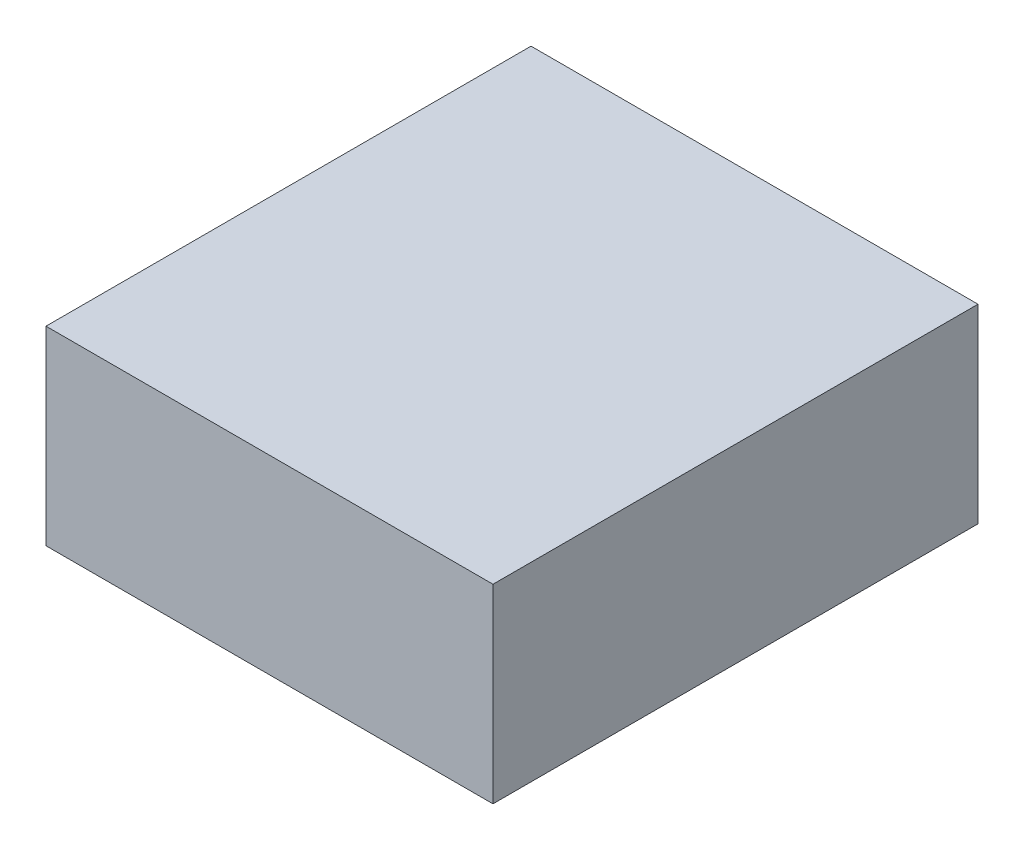
ISO-10303-21;
HEADER;
FILE_DESCRIPTION(('STEP AP214'),'2;1');
FILE_NAME('part.step','',(''),(''),'','','');
FILE_SCHEMA(('AUTOMOTIVE_DESIGN { 1 0 10303 214 1 1 1 1 }'));
ENDSEC;
DATA;
#1=APPLICATION_CONTEXT('core data for automotive mechanical design processes');
#2=APPLICATION_PROTOCOL_DEFINITION('international standard','automotive_design',2000,#1);
#3=PRODUCT_CONTEXT('',#1,'mechanical');
#4=PRODUCT('Part','Part','',(#3));
#5=PRODUCT_RELATED_PRODUCT_CATEGORY('part','',(#4));
#6=PRODUCT_DEFINITION_FORMATION('','',#4);
#7=PRODUCT_DEFINITION_CONTEXT('part definition',#1,'design');
#8=PRODUCT_DEFINITION('design','',#6,#7);
#9=PRODUCT_DEFINITION_SHAPE('','',#8);
#10=(LENGTH_UNIT() NAMED_UNIT(*) SI_UNIT(.MILLI.,.METRE.));
#11=(NAMED_UNIT(*) PLANE_ANGLE_UNIT() SI_UNIT($,.RADIAN.));
#12=(NAMED_UNIT(*) SI_UNIT($,.STERADIAN.) SOLID_ANGLE_UNIT());
#13=UNCERTAINTY_MEASURE_WITH_UNIT(LENGTH_MEASURE(1.E-05),#10,'distance_accuracy_value','');
#14=(GEOMETRIC_REPRESENTATION_CONTEXT(3) GLOBAL_UNCERTAINTY_ASSIGNED_CONTEXT((#13)) GLOBAL_UNIT_ASSIGNED_CONTEXT((#10,
#11,#12)) REPRESENTATION_CONTEXT('',''));
#15=CARTESIAN_POINT('',(0.,0.,0.));
#16=DIRECTION('',(0.,0.,1.));
#17=DIRECTION('',(1.,0.,0.));
#18=AXIS2_PLACEMENT_3D('',#15,#16,#17);
#19=CARTESIAN_POINT('',(23.5,20.,25.5));
#20=DIRECTION('',(-1.,0.,0.));
#21=DIRECTION('',(0.,0.,1.));
#22=AXIS2_PLACEMENT_3D('',#19,#20,#21);
#23=PLANE('',#22);
#24=DIRECTION('',(0.,0.,-1.));
#25=VECTOR('',#24,1.);
#26=CARTESIAN_POINT('',(23.5,0.,25.5));
#27=LINE('',#26,#25);
#28=CARTESIAN_POINT('',(23.5,0.,25.5));
#29=VERTEX_POINT('',#28);
#30=CARTESIAN_POINT('',(23.5,0.,-25.5));
#31=VERTEX_POINT('',#30);
#32=EDGE_CURVE('E97',#29,#31,#27,.T.);
#33=ORIENTED_EDGE('',*,*,#32,.T.);
#34=DIRECTION('',(0.,-1.,0.));
#35=VECTOR('',#34,1.);
#36=CARTESIAN_POINT('',(23.5,20.,-25.5));
#37=LINE('',#36,#35);
#38=CARTESIAN_POINT('',(23.5,20.,-25.5));
#39=VERTEX_POINT('',#38);
#40=EDGE_CURVE('E11',#39,#31,#37,.T.);
#41=ORIENTED_EDGE('',*,*,#40,.F.);
#42=DIRECTION('',(0.,0.,-1.));
#43=VECTOR('',#42,1.);
#44=CARTESIAN_POINT('',(23.5,20.,25.5));
#45=LINE('',#44,#43);
#46=CARTESIAN_POINT('',(23.5,20.,25.5));
#47=VERTEX_POINT('',#46);
#48=EDGE_CURVE('E85',#47,#39,#45,.T.);
#49=ORIENTED_EDGE('',*,*,#48,.F.);
#50=DIRECTION('',(0.,-1.,0.));
#51=VECTOR('',#50,1.);
#52=CARTESIAN_POINT('',(23.5,20.,25.5));
#53=LINE('',#52,#51);
#54=EDGE_CURVE('E93',#47,#29,#53,.T.);
#55=ORIENTED_EDGE('',*,*,#54,.T.);
#56=EDGE_LOOP('',(#33,#41,#49,#55));
#57=FACE_BOUND('',#56,.T.);
#58=ADVANCED_FACE('F34',(#57),#23,.F.);
#59=CARTESIAN_POINT('',(-23.5,20.,-25.5));
#60=DIRECTION('',(0.,0.,1.));
#61=DIRECTION('',(1.,0.,0.));
#62=AXIS2_PLACEMENT_3D('',#59,#60,#61);
#63=PLANE('',#62);
#64=DIRECTION('',(-1.,0.,0.));
#65=VECTOR('',#64,1.);
#66=CARTESIAN_POINT('',(-23.5,0.,-25.5));
#67=LINE('',#66,#65);
#68=CARTESIAN_POINT('',(-23.5,0.,-25.5));
#69=VERTEX_POINT('',#68);
#70=EDGE_CURVE('E89',#31,#69,#67,.T.);
#71=ORIENTED_EDGE('',*,*,#70,.T.);
#72=DIRECTION('',(0.,-1.,0.));
#73=VECTOR('',#72,1.);
#74=CARTESIAN_POINT('',(-23.5,20.,-25.5));
#75=LINE('',#74,#73);
#76=CARTESIAN_POINT('',(-23.5,20.,-25.5));
#77=VERTEX_POINT('',#76);
#78=EDGE_CURVE('E42',#77,#69,#75,.T.);
#79=ORIENTED_EDGE('',*,*,#78,.F.);
#80=DIRECTION('',(-1.,0.,0.));
#81=VECTOR('',#80,1.);
#82=CARTESIAN_POINT('',(-23.5,20.,-25.5));
#83=LINE('',#82,#81);
#84=EDGE_CURVE('E80',#39,#77,#83,.T.);
#85=ORIENTED_EDGE('',*,*,#84,.F.);
#86=ORIENTED_EDGE('',*,*,#40,.T.);
#87=EDGE_LOOP('',(#71,#79,#85,#86));
#88=FACE_BOUND('',#87,.T.);
#89=ADVANCED_FACE('F88',(#88),#63,.F.);
#90=CARTESIAN_POINT('',(-23.5,20.,25.5));
#91=DIRECTION('',(1.,0.,0.));
#92=DIRECTION('',(0.,0.,-1.));
#93=AXIS2_PLACEMENT_3D('',#90,#91,#92);
#94=PLANE('',#93);
#95=DIRECTION('',(0.,0.,1.));
#96=VECTOR('',#95,1.);
#97=CARTESIAN_POINT('',(-23.5,0.,25.5));
#98=LINE('',#97,#96);
#99=CARTESIAN_POINT('',(-23.5,0.,25.5));
#100=VERTEX_POINT('',#99);
#101=EDGE_CURVE('E67',#69,#100,#98,.T.);
#102=ORIENTED_EDGE('',*,*,#101,.T.);
#103=DIRECTION('',(0.,-1.,0.));
#104=VECTOR('',#103,1.);
#105=CARTESIAN_POINT('',(-23.5,20.,25.5));
#106=LINE('',#105,#104);
#107=CARTESIAN_POINT('',(-23.5,20.,25.5));
#108=VERTEX_POINT('',#107);
#109=EDGE_CURVE('E90',#108,#100,#106,.T.);
#110=ORIENTED_EDGE('',*,*,#109,.F.);
#111=DIRECTION('',(0.,0.,1.));
#112=VECTOR('',#111,1.);
#113=CARTESIAN_POINT('',(-23.5,20.,25.5));
#114=LINE('',#113,#112);
#115=EDGE_CURVE('E83',#77,#108,#114,.T.);
#116=ORIENTED_EDGE('',*,*,#115,.F.);
#117=ORIENTED_EDGE('',*,*,#78,.T.);
#118=EDGE_LOOP('',(#102,#110,#116,#117));
#119=FACE_BOUND('',#118,.T.);
#120=ADVANCED_FACE('F91',(#119),#94,.F.);
#121=CARTESIAN_POINT('',(-23.5,20.,25.5));
#122=DIRECTION('',(0.,0.,-1.));
#123=DIRECTION('',(-1.,0.,0.));
#124=AXIS2_PLACEMENT_3D('',#121,#122,#123);
#125=PLANE('',#124);
#126=DIRECTION('',(1.,0.,0.));
#127=VECTOR('',#126,1.);
#128=CARTESIAN_POINT('',(-23.5,0.,25.5));
#129=LINE('',#128,#127);
#130=EDGE_CURVE('E73',#100,#29,#129,.T.);
#131=ORIENTED_EDGE('',*,*,#130,.T.);
#132=ORIENTED_EDGE('',*,*,#54,.F.);
#133=DIRECTION('',(1.,0.,0.));
#134=VECTOR('',#133,1.);
#135=CARTESIAN_POINT('',(-23.5,20.,25.5));
#136=LINE('',#135,#134);
#137=EDGE_CURVE('E50',#108,#47,#136,.T.);
#138=ORIENTED_EDGE('',*,*,#137,.F.);
#139=ORIENTED_EDGE('',*,*,#109,.T.);
#140=EDGE_LOOP('',(#131,#132,#138,#139));
#141=FACE_BOUND('',#140,.T.);
#142=ADVANCED_FACE('F104',(#141),#125,.F.);
#143=CARTESIAN_POINT('',(0.,20.,0.));
#144=DIRECTION('',(0.,-1.,0.));
#145=DIRECTION('',(0.,0.,-1.));
#146=AXIS2_PLACEMENT_3D('',#143,#144,#145);
#147=PLANE('',#146);
#148=ORIENTED_EDGE('',*,*,#48,.T.);
#149=ORIENTED_EDGE('',*,*,#84,.T.);
#150=ORIENTED_EDGE('',*,*,#115,.T.);
#151=ORIENTED_EDGE('',*,*,#137,.T.);
#152=EDGE_LOOP('',(#148,#149,#150,#151));
#153=FACE_BOUND('',#152,.T.);
#154=ADVANCED_FACE('F81',(#153),#147,.F.);
#155=CARTESIAN_POINT('',(0.,0.,0.));
#156=DIRECTION('',(0.,-1.,0.));
#157=DIRECTION('',(0.,0.,-1.));
#158=AXIS2_PLACEMENT_3D('',#155,#156,#157);
#159=PLANE('',#158);
#160=ORIENTED_EDGE('',*,*,#32,.F.);
#161=ORIENTED_EDGE('',*,*,#130,.F.);
#162=ORIENTED_EDGE('',*,*,#101,.F.);
#163=ORIENTED_EDGE('',*,*,#70,.F.);
#164=EDGE_LOOP('',(#160,#161,#162,#163));
#165=FACE_BOUND('',#164,.T.);
#166=ADVANCED_FACE('F107',(#165),#159,.T.);
#167=CLOSED_SHELL('',(#58,#89,#120,#142,#154,#166));
#168=MANIFOLD_SOLID_BREP('B2',#167);
#169=ADVANCED_BREP_SHAPE_REPRESENTATION('',(#18,#168),#14);
#170=SHAPE_DEFINITION_REPRESENTATION(#9,#169);
ENDSEC;
END-ISO-10303-21;
